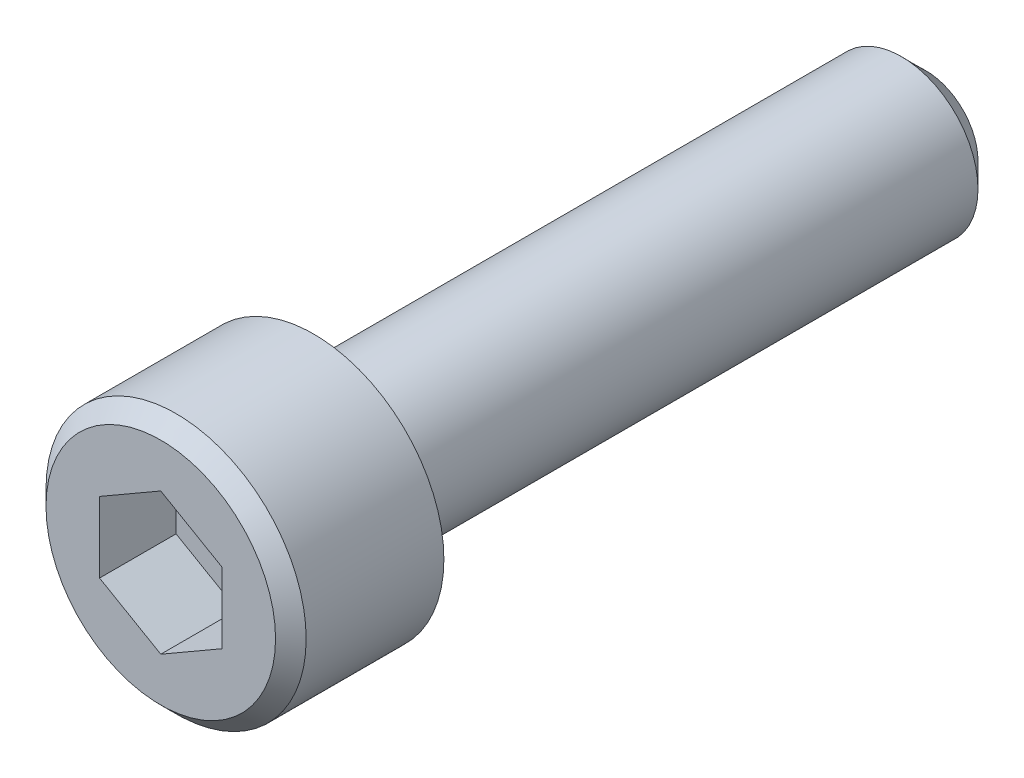
ISO-10303-21;
HEADER;
FILE_DESCRIPTION(('STEP AP214'),'2;1');
FILE_NAME('part.step','',(''),(''),'','','');
FILE_SCHEMA(('AUTOMOTIVE_DESIGN { 1 0 10303 214 1 1 1 1 }'));
ENDSEC;
DATA;
#1=APPLICATION_CONTEXT('core data for automotive mechanical design processes');
#2=APPLICATION_PROTOCOL_DEFINITION('international standard','automotive_design',2000,#1);
#3=PRODUCT_CONTEXT('',#1,'mechanical');
#4=PRODUCT('Part','Part','',(#3));
#5=PRODUCT_RELATED_PRODUCT_CATEGORY('part','',(#4));
#6=PRODUCT_DEFINITION_FORMATION('','',#4);
#7=PRODUCT_DEFINITION_CONTEXT('part definition',#1,'design');
#8=PRODUCT_DEFINITION('design','',#6,#7);
#9=PRODUCT_DEFINITION_SHAPE('','',#8);
#10=(LENGTH_UNIT() NAMED_UNIT(*) SI_UNIT(.MILLI.,.METRE.));
#11=(NAMED_UNIT(*) PLANE_ANGLE_UNIT() SI_UNIT($,.RADIAN.));
#12=(NAMED_UNIT(*) SI_UNIT($,.STERADIAN.) SOLID_ANGLE_UNIT());
#13=UNCERTAINTY_MEASURE_WITH_UNIT(LENGTH_MEASURE(1.E-05),#10,'distance_accuracy_value','');
#14=(GEOMETRIC_REPRESENTATION_CONTEXT(3) GLOBAL_UNCERTAINTY_ASSIGNED_CONTEXT((#13)) GLOBAL_UNIT_ASSIGNED_CONTEXT((#10,
#11,#12)) REPRESENTATION_CONTEXT('',''));
#15=CARTESIAN_POINT('',(0.,0.,0.));
#16=DIRECTION('',(0.,0.,1.));
#17=DIRECTION('',(1.,0.,0.));
#18=AXIS2_PLACEMENT_3D('',#15,#16,#17);
#19=CARTESIAN_POINT('',(0.,0.,5.));
#20=DIRECTION('',(0.,0.,1.));
#21=DIRECTION('',(1.,0.,0.));
#22=AXIS2_PLACEMENT_3D('',#19,#20,#21);
#23=PLANE('',#22);
#24=CARTESIAN_POINT('',(0.,0.,5.));
#25=DIRECTION('',(0.,0.,1.));
#26=DIRECTION('',(1.,0.,0.));
#27=AXIS2_PLACEMENT_3D('',#24,#25,#26);
#28=CIRCLE('',#27,3.75);
#29=CARTESIAN_POINT('',(3.75,0.,5.));
#30=VERTEX_POINT('',#29);
#31=EDGE_CURVE('E9',#30,#30,#28,.T.);
#32=ORIENTED_EDGE('',*,*,#31,.T.);
#33=EDGE_LOOP('',(#32));
#34=FACE_BOUND('',#33,.T.);
#35=DIRECTION('',(0.,-1.,0.));
#36=VECTOR('',#35,1.);
#37=CARTESIAN_POINT('',(2.,1.15470053837925,5.));
#38=LINE('',#37,#36);
#39=CARTESIAN_POINT('',(2.,1.15470053837925,5.));
#40=VERTEX_POINT('',#39);
#41=CARTESIAN_POINT('',(2.,-1.15470053837925,5.));
#42=VERTEX_POINT('',#41);
#43=EDGE_CURVE('E101',#40,#42,#38,.T.);
#44=ORIENTED_EDGE('',*,*,#43,.T.);
#45=DIRECTION('',(-0.866025403784438,-0.5,0.));
#46=VECTOR('',#45,1.);
#47=CARTESIAN_POINT('',(2.,-1.15470053837925,5.));
#48=LINE('',#47,#46);
#49=CARTESIAN_POINT('',(0.,-2.3094010767585,5.));
#50=VERTEX_POINT('',#49);
#51=EDGE_CURVE('E29',#42,#50,#48,.T.);
#52=ORIENTED_EDGE('',*,*,#51,.T.);
#53=DIRECTION('',(-0.866025403784439,0.5,0.));
#54=VECTOR('',#53,1.);
#55=CARTESIAN_POINT('',(0.,-2.3094010767585,5.));
#56=LINE('',#55,#54);
#57=CARTESIAN_POINT('',(-2.,-1.15470053837925,5.));
#58=VERTEX_POINT('',#57);
#59=EDGE_CURVE('E102',#50,#58,#56,.T.);
#60=ORIENTED_EDGE('',*,*,#59,.T.);
#61=DIRECTION('',(0.,1.,0.));
#62=VECTOR('',#61,1.);
#63=CARTESIAN_POINT('',(-1.99999999999999,-1.15470053837925,5.));
#64=LINE('',#63,#62);
#65=CARTESIAN_POINT('',(-1.99999999999999,1.15470053837925,5.));
#66=VERTEX_POINT('',#65);
#67=EDGE_CURVE('E106',#58,#66,#64,.T.);
#68=ORIENTED_EDGE('',*,*,#67,.T.);
#69=DIRECTION('',(0.866025403784438,0.5,0.));
#70=VECTOR('',#69,1.);
#71=CARTESIAN_POINT('',(-2.,1.15470053837925,5.));
#72=LINE('',#71,#70);
#73=CARTESIAN_POINT('',(0.,2.3094010767585,5.));
#74=VERTEX_POINT('',#73);
#75=EDGE_CURVE('E110',#66,#74,#72,.T.);
#76=ORIENTED_EDGE('',*,*,#75,.T.);
#77=DIRECTION('',(0.866025403784438,-0.5,0.));
#78=VECTOR('',#77,1.);
#79=CARTESIAN_POINT('',(0.,2.3094010767585,5.));
#80=LINE('',#79,#78);
#81=EDGE_CURVE('E90',#74,#40,#80,.T.);
#82=ORIENTED_EDGE('',*,*,#81,.T.);
#83=EDGE_LOOP('',(#44,#52,#60,#68,#76,#82));
#84=FACE_BOUND('',#83,.T.);
#85=ADVANCED_FACE('F15',(#34,#84),#23,.T.);
#86=CARTESIAN_POINT('',(0.,0.,5.));
#87=DIRECTION('',(0.,0.,-1.));
#88=DIRECTION('',(-1.,0.,0.));
#89=AXIS2_PLACEMENT_3D('',#86,#87,#88);
#90=CONICAL_SURFACE('',#89,3.75,0.785398163397448);
#91=CARTESIAN_POINT('',(0.,0.,4.5));
#92=DIRECTION('',(0.,0.,1.));
#93=DIRECTION('',(1.,0.,0.));
#94=AXIS2_PLACEMENT_3D('',#91,#92,#93);
#95=CIRCLE('',#94,4.25);
#96=CARTESIAN_POINT('',(4.25,0.,4.5));
#97=VERTEX_POINT('',#96);
#98=EDGE_CURVE('E22',#97,#97,#95,.T.);
#99=ORIENTED_EDGE('',*,*,#98,.T.);
#100=EDGE_LOOP('',(#99));
#101=FACE_BOUND('',#100,.T.);
#102=ORIENTED_EDGE('',*,*,#31,.F.);
#103=EDGE_LOOP('',(#102));
#104=FACE_BOUND('',#103,.T.);
#105=ADVANCED_FACE('F141',(#101,#104),#90,.T.);
#106=CARTESIAN_POINT('',(0.,0.,54.));
#107=DIRECTION('',(0.,0.,1.));
#108=DIRECTION('',(1.,0.,0.));
#109=AXIS2_PLACEMENT_3D('',#106,#107,#108);
#110=CYLINDRICAL_SURFACE('',#109,4.25);
#111=CARTESIAN_POINT('',(0.,0.,0.));
#112=DIRECTION('',(0.,0.,1.));
#113=DIRECTION('',(1.,0.,0.));
#114=AXIS2_PLACEMENT_3D('',#111,#112,#113);
#115=CIRCLE('',#114,4.25);
#116=CARTESIAN_POINT('',(4.25,0.,0.));
#117=VERTEX_POINT('',#116);
#118=EDGE_CURVE('E136',#117,#117,#115,.T.);
#119=ORIENTED_EDGE('',*,*,#118,.T.);
#120=EDGE_LOOP('',(#119));
#121=FACE_BOUND('',#120,.T.);
#122=ORIENTED_EDGE('',*,*,#98,.F.);
#123=EDGE_LOOP('',(#122));
#124=FACE_BOUND('',#123,.T.);
#125=ADVANCED_FACE('F144',(#121,#124),#110,.T.);
#126=CARTESIAN_POINT('',(4.25,0.,0.));
#127=DIRECTION('',(0.,0.,-1.));
#128=DIRECTION('',(-1.,0.,0.));
#129=AXIS2_PLACEMENT_3D('',#126,#127,#128);
#130=PLANE('',#129);
#131=CARTESIAN_POINT('',(0.,0.,0.));
#132=DIRECTION('',(0.,0.,1.));
#133=DIRECTION('',(1.,0.,0.));
#134=AXIS2_PLACEMENT_3D('',#131,#132,#133);
#135=CIRCLE('',#134,2.5);
#136=CARTESIAN_POINT('',(2.5,0.,0.));
#137=VERTEX_POINT('',#136);
#138=EDGE_CURVE('E133',#137,#137,#135,.T.);
#139=ORIENTED_EDGE('',*,*,#138,.T.);
#140=EDGE_LOOP('',(#139));
#141=FACE_BOUND('',#140,.T.);
#142=ORIENTED_EDGE('',*,*,#118,.F.);
#143=EDGE_LOOP('',(#142));
#144=FACE_BOUND('',#143,.T.);
#145=ADVANCED_FACE('F146',(#141,#144),#130,.T.);
#146=CARTESIAN_POINT('',(0.,0.,54.));
#147=DIRECTION('',(0.,0.,1.));
#148=DIRECTION('',(1.,0.,0.));
#149=AXIS2_PLACEMENT_3D('',#146,#147,#148);
#150=CYLINDRICAL_SURFACE('',#149,2.5);
#151=CARTESIAN_POINT('',(0.,0.,-19.2));
#152=DIRECTION('',(0.,0.,1.));
#153=DIRECTION('',(1.,0.,0.));
#154=AXIS2_PLACEMENT_3D('',#151,#152,#153);
#155=CIRCLE('',#154,2.5);
#156=CARTESIAN_POINT('',(2.5,0.,-19.2));
#157=VERTEX_POINT('',#156);
#158=EDGE_CURVE('E130',#157,#157,#155,.T.);
#159=ORIENTED_EDGE('',*,*,#158,.T.);
#160=EDGE_LOOP('',(#159));
#161=FACE_BOUND('',#160,.T.);
#162=ORIENTED_EDGE('',*,*,#138,.F.);
#163=EDGE_LOOP('',(#162));
#164=FACE_BOUND('',#163,.T.);
#165=ADVANCED_FACE('F154',(#161,#164),#150,.T.);
#166=CARTESIAN_POINT('',(0.,0.,-19.2));
#167=DIRECTION('',(0.,0.,1.));
#168=DIRECTION('',(1.,0.,0.));
#169=AXIS2_PLACEMENT_3D('',#166,#167,#168);
#170=CONICAL_SURFACE('',#169,2.5,0.785398163397451);
#171=CARTESIAN_POINT('',(0.,0.,-20.));
#172=DIRECTION('',(0.,0.,1.));
#173=DIRECTION('',(1.,0.,0.));
#174=AXIS2_PLACEMENT_3D('',#171,#172,#173);
#175=CIRCLE('',#174,1.7);
#176=CARTESIAN_POINT('',(1.7,0.,-20.));
#177=VERTEX_POINT('',#176);
#178=EDGE_CURVE('E127',#177,#177,#175,.T.);
#179=ORIENTED_EDGE('',*,*,#178,.T.);
#180=EDGE_LOOP('',(#179));
#181=FACE_BOUND('',#180,.T.);
#182=ORIENTED_EDGE('',*,*,#158,.F.);
#183=EDGE_LOOP('',(#182));
#184=FACE_BOUND('',#183,.T.);
#185=ADVANCED_FACE('F188',(#181,#184),#170,.T.);
#186=CARTESIAN_POINT('',(1.7,0.,-20.));
#187=DIRECTION('',(0.,0.,-1.));
#188=DIRECTION('',(-1.,0.,0.));
#189=AXIS2_PLACEMENT_3D('',#186,#187,#188);
#190=PLANE('',#189);
#191=ORIENTED_EDGE('',*,*,#178,.F.);
#192=EDGE_LOOP('',(#191));
#193=FACE_BOUND('',#192,.T.);
#194=ADVANCED_FACE('F185',(#193),#190,.T.);
#195=CARTESIAN_POINT('',(2.,-1.15470053837925,2.5));
#196=DIRECTION('',(-0.5,0.866025403784438,0.));
#197=DIRECTION('',(-0.866025403784438,-0.5,0.));
#198=AXIS2_PLACEMENT_3D('',#195,#196,#197);
#199=PLANE('',#198);
#200=ORIENTED_EDGE('',*,*,#51,.F.);
#201=DIRECTION('',(0.,0.,1.));
#202=VECTOR('',#201,1.);
#203=CARTESIAN_POINT('',(2.,-1.15470053837925,2.5));
#204=LINE('',#203,#202);
#205=CARTESIAN_POINT('',(2.,-1.15470053837925,2.5));
#206=VERTEX_POINT('',#205);
#207=EDGE_CURVE('E95',#206,#42,#204,.T.);
#208=ORIENTED_EDGE('',*,*,#207,.F.);
#209=DIRECTION('',(-0.866025403784438,-0.5,0.));
#210=VECTOR('',#209,1.);
#211=CARTESIAN_POINT('',(2.,-1.15470053837925,2.5));
#212=LINE('',#211,#210);
#213=CARTESIAN_POINT('',(0.,-2.3094010767585,2.5));
#214=VERTEX_POINT('',#213);
#215=EDGE_CURVE('E99',#206,#214,#212,.T.);
#216=ORIENTED_EDGE('',*,*,#215,.T.);
#217=DIRECTION('',(0.,0.,1.));
#218=VECTOR('',#217,1.);
#219=CARTESIAN_POINT('',(0.,-2.3094010767585,2.5));
#220=LINE('',#219,#218);
#221=EDGE_CURVE('E125',#214,#50,#220,.T.);
#222=ORIENTED_EDGE('',*,*,#221,.T.);
#223=EDGE_LOOP('',(#200,#208,#216,#222));
#224=FACE_BOUND('',#223,.T.);
#225=ADVANCED_FACE('F164',(#224),#199,.T.);
#226=CARTESIAN_POINT('',(0.,-2.3094010767585,2.5));
#227=DIRECTION('',(0.5,0.866025403784439,0.));
#228=DIRECTION('',(-0.866025403784439,0.5,0.));
#229=AXIS2_PLACEMENT_3D('',#226,#227,#228);
#230=PLANE('',#229);
#231=ORIENTED_EDGE('',*,*,#59,.F.);
#232=ORIENTED_EDGE('',*,*,#221,.F.);
#233=DIRECTION('',(-0.866025403784439,0.5,0.));
#234=VECTOR('',#233,1.);
#235=CARTESIAN_POINT('',(0.,-2.3094010767585,2.5));
#236=LINE('',#235,#234);
#237=CARTESIAN_POINT('',(-2.,-1.15470053837925,2.5));
#238=VERTEX_POINT('',#237);
#239=EDGE_CURVE('E68',#214,#238,#236,.T.);
#240=ORIENTED_EDGE('',*,*,#239,.T.);
#241=DIRECTION('',(0.,0.,1.));
#242=VECTOR('',#241,1.);
#243=CARTESIAN_POINT('',(-2.,-1.15470053837925,2.5));
#244=LINE('',#243,#242);
#245=EDGE_CURVE('E123',#238,#58,#244,.T.);
#246=ORIENTED_EDGE('',*,*,#245,.T.);
#247=EDGE_LOOP('',(#231,#232,#240,#246));
#248=FACE_BOUND('',#247,.T.);
#249=ADVANCED_FACE('F167',(#248),#230,.T.);
#250=CARTESIAN_POINT('',(-1.99999999999999,-1.15470053837925,2.5));
#251=DIRECTION('',(1.,0.,0.));
#252=DIRECTION('',(0.,0.,-1.));
#253=AXIS2_PLACEMENT_3D('',#250,#251,#252);
#254=PLANE('',#253);
#255=ORIENTED_EDGE('',*,*,#67,.F.);
#256=ORIENTED_EDGE('',*,*,#245,.F.);
#257=DIRECTION('',(0.,1.,0.));
#258=VECTOR('',#257,1.);
#259=CARTESIAN_POINT('',(-1.99999999999999,-1.15470053837925,2.5));
#260=LINE('',#259,#258);
#261=CARTESIAN_POINT('',(-1.99999999999999,1.15470053837925,2.5));
#262=VERTEX_POINT('',#261);
#263=EDGE_CURVE('E86',#238,#262,#260,.T.);
#264=ORIENTED_EDGE('',*,*,#263,.T.);
#265=DIRECTION('',(0.,0.,1.));
#266=VECTOR('',#265,1.);
#267=CARTESIAN_POINT('',(-1.99999999999999,1.15470053837925,2.5));
#268=LINE('',#267,#266);
#269=EDGE_CURVE('E83',#262,#66,#268,.T.);
#270=ORIENTED_EDGE('',*,*,#269,.T.);
#271=EDGE_LOOP('',(#255,#256,#264,#270));
#272=FACE_BOUND('',#271,.T.);
#273=ADVANCED_FACE('F171',(#272),#254,.T.);
#274=CARTESIAN_POINT('',(-2.,1.15470053837925,2.5));
#275=DIRECTION('',(0.5,-0.866025403784438,0.));
#276=DIRECTION('',(0.866025403784438,0.5,0.));
#277=AXIS2_PLACEMENT_3D('',#274,#275,#276);
#278=PLANE('',#277);
#279=ORIENTED_EDGE('',*,*,#75,.F.);
#280=ORIENTED_EDGE('',*,*,#269,.F.);
#281=DIRECTION('',(0.866025403784438,0.5,0.));
#282=VECTOR('',#281,1.);
#283=CARTESIAN_POINT('',(-2.,1.15470053837925,2.5));
#284=LINE('',#283,#282);
#285=CARTESIAN_POINT('',(0.,2.3094010767585,2.5));
#286=VERTEX_POINT('',#285);
#287=EDGE_CURVE('E78',#262,#286,#284,.T.);
#288=ORIENTED_EDGE('',*,*,#287,.T.);
#289=DIRECTION('',(0.,0.,1.));
#290=VECTOR('',#289,1.);
#291=CARTESIAN_POINT('',(0.,2.3094010767585,2.5));
#292=LINE('',#291,#290);
#293=EDGE_CURVE('E82',#286,#74,#292,.T.);
#294=ORIENTED_EDGE('',*,*,#293,.T.);
#295=EDGE_LOOP('',(#279,#280,#288,#294));
#296=FACE_BOUND('',#295,.T.);
#297=ADVANCED_FACE('F81',(#296),#278,.T.);
#298=CARTESIAN_POINT('',(0.,2.3094010767585,2.5));
#299=DIRECTION('',(-0.5,-0.866025403784438,0.));
#300=DIRECTION('',(0.866025403784438,-0.5,0.));
#301=AXIS2_PLACEMENT_3D('',#298,#299,#300);
#302=PLANE('',#301);
#303=ORIENTED_EDGE('',*,*,#81,.F.);
#304=ORIENTED_EDGE('',*,*,#293,.F.);
#305=DIRECTION('',(0.866025403784438,-0.5,0.));
#306=VECTOR('',#305,1.);
#307=CARTESIAN_POINT('',(0.,2.3094010767585,2.5));
#308=LINE('',#307,#306);
#309=CARTESIAN_POINT('',(2.,1.15470053837925,2.5));
#310=VERTEX_POINT('',#309);
#311=EDGE_CURVE('E85',#286,#310,#308,.T.);
#312=ORIENTED_EDGE('',*,*,#311,.T.);
#313=DIRECTION('',(0.,0.,1.));
#314=VECTOR('',#313,1.);
#315=CARTESIAN_POINT('',(2.,1.15470053837925,2.5));
#316=LINE('',#315,#314);
#317=EDGE_CURVE('E59',#310,#40,#316,.T.);
#318=ORIENTED_EDGE('',*,*,#317,.T.);
#319=EDGE_LOOP('',(#303,#304,#312,#318));
#320=FACE_BOUND('',#319,.T.);
#321=ADVANCED_FACE('F88',(#320),#302,.T.);
#322=CARTESIAN_POINT('',(2.,1.15470053837925,2.5));
#323=DIRECTION('',(-1.,0.,0.));
#324=DIRECTION('',(0.,0.,1.));
#325=AXIS2_PLACEMENT_3D('',#322,#323,#324);
#326=PLANE('',#325);
#327=ORIENTED_EDGE('',*,*,#43,.F.);
#328=ORIENTED_EDGE('',*,*,#317,.F.);
#329=DIRECTION('',(0.,-1.,0.));
#330=VECTOR('',#329,1.);
#331=CARTESIAN_POINT('',(2.,1.15470053837925,2.5));
#332=LINE('',#331,#330);
#333=EDGE_CURVE('E37',#310,#206,#332,.T.);
#334=ORIENTED_EDGE('',*,*,#333,.T.);
#335=ORIENTED_EDGE('',*,*,#207,.T.);
#336=EDGE_LOOP('',(#327,#328,#334,#335));
#337=FACE_BOUND('',#336,.T.);
#338=ADVANCED_FACE('F163',(#337),#326,.T.);
#339=CARTESIAN_POINT('',(4.,0.,2.5));
#340=DIRECTION('',(0.,0.,1.));
#341=DIRECTION('',(1.,0.,0.));
#342=AXIS2_PLACEMENT_3D('',#339,#340,#341);
#343=PLANE('',#342);
#344=ORIENTED_EDGE('',*,*,#215,.F.);
#345=ORIENTED_EDGE('',*,*,#333,.F.);
#346=ORIENTED_EDGE('',*,*,#311,.F.);
#347=ORIENTED_EDGE('',*,*,#287,.F.);
#348=ORIENTED_EDGE('',*,*,#263,.F.);
#349=ORIENTED_EDGE('',*,*,#239,.F.);
#350=EDGE_LOOP('',(#344,#345,#346,#347,#348,#349));
#351=FACE_BOUND('',#350,.T.);
#352=ADVANCED_FACE('F93',(#351),#343,.T.);
#353=CLOSED_SHELL('',(#85,#105,#125,#145,#165,#185,#194,#225,#249,#273,#297,#321,#338,#352));
#354=MANIFOLD_SOLID_BREP('B1',#353);
#355=ADVANCED_BREP_SHAPE_REPRESENTATION('',(#18,#354),#14);
#356=SHAPE_DEFINITION_REPRESENTATION(#9,#355);
ENDSEC;
END-ISO-10303-21;
